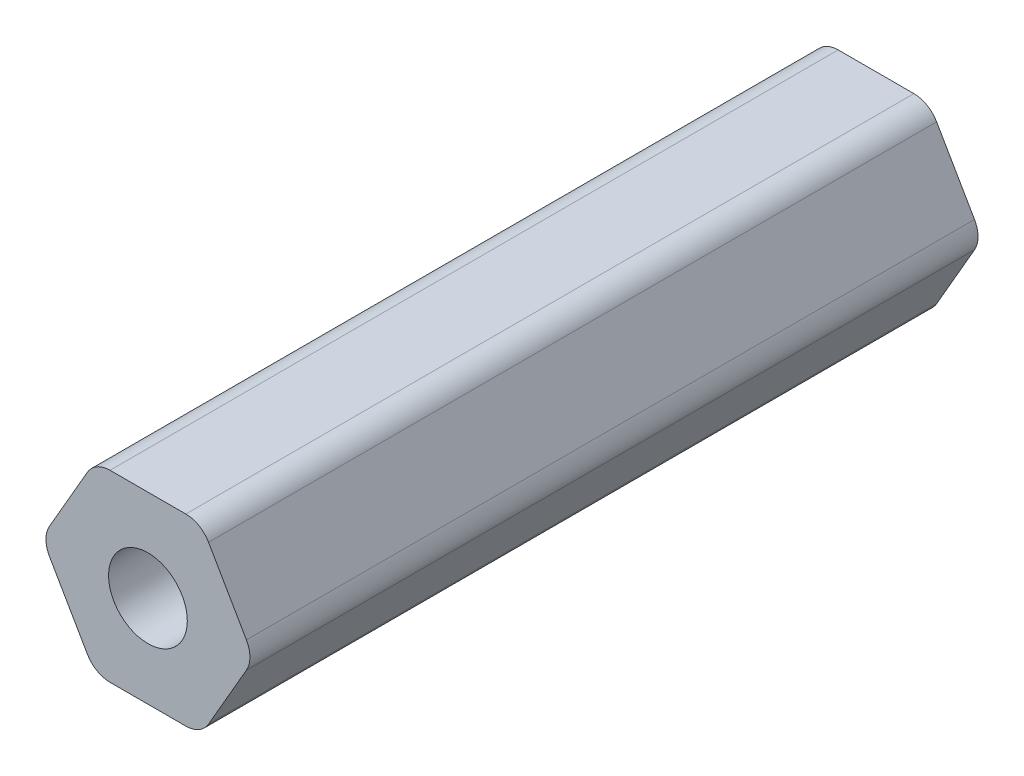
ISO-10303-21;
HEADER;
FILE_DESCRIPTION(('STEP AP214'),'2;1');
FILE_NAME('part.step','',(''),(''),'','','');
FILE_SCHEMA(('AUTOMOTIVE_DESIGN { 1 0 10303 214 1 1 1 1 }'));
ENDSEC;
DATA;
#1=APPLICATION_CONTEXT('core data for automotive mechanical design processes');
#2=APPLICATION_PROTOCOL_DEFINITION('international standard','automotive_design',2000,#1);
#3=PRODUCT_CONTEXT('',#1,'mechanical');
#4=PRODUCT('Part','Part','',(#3));
#5=PRODUCT_RELATED_PRODUCT_CATEGORY('part','',(#4));
#6=PRODUCT_DEFINITION_FORMATION('','',#4);
#7=PRODUCT_DEFINITION_CONTEXT('part definition',#1,'design');
#8=PRODUCT_DEFINITION('design','',#6,#7);
#9=PRODUCT_DEFINITION_SHAPE('','',#8);
#10=(LENGTH_UNIT() NAMED_UNIT(*) SI_UNIT(.MILLI.,.METRE.));
#11=(NAMED_UNIT(*) PLANE_ANGLE_UNIT() SI_UNIT($,.RADIAN.));
#12=(NAMED_UNIT(*) SI_UNIT($,.STERADIAN.) SOLID_ANGLE_UNIT());
#13=UNCERTAINTY_MEASURE_WITH_UNIT(LENGTH_MEASURE(1.E-05),#10,'distance_accuracy_value','');
#14=(GEOMETRIC_REPRESENTATION_CONTEXT(3) GLOBAL_UNCERTAINTY_ASSIGNED_CONTEXT((#13)) GLOBAL_UNIT_ASSIGNED_CONTEXT((#10,
#11,#12)) REPRESENTATION_CONTEXT('',''));
#15=CARTESIAN_POINT('',(0.,0.,0.));
#16=DIRECTION('',(0.,0.,1.));
#17=DIRECTION('',(1.,0.,0.));
#18=AXIS2_PLACEMENT_3D('',#15,#16,#17);
#19=CARTESIAN_POINT('',(-2.88675134594813,0.,27.75));
#20=DIRECTION('',(0.,0.,1.));
#21=DIRECTION('',(1.,0.,0.));
#22=AXIS2_PLACEMENT_3D('',#19,#20,#21);
#23=PLANE('',#22);
#24=CARTESIAN_POINT('',(-2.88675134594813,0.,27.75));
#25=DIRECTION('',(0.,0.,1.));
#26=DIRECTION('',(1.,0.,0.));
#27=AXIS2_PLACEMENT_3D('',#24,#25,#26);
#28=CIRCLE('',#27,1.);
#29=CARTESIAN_POINT('',(-3.75277674973257,0.500000000000003,27.75));
#30=VERTEX_POINT('',#29);
#31=CARTESIAN_POINT('',(-3.75277674973257,-0.500000000000004,27.75));
#32=VERTEX_POINT('',#31);
#33=EDGE_CURVE('E179',#30,#32,#28,.T.);
#34=ORIENTED_EDGE('',*,*,#33,.T.);
#35=DIRECTION('',(0.5,-0.866025403784439,0.));
#36=VECTOR('',#35,1.);
#37=CARTESIAN_POINT('',(-3.75277674973257,-0.500000000000004,27.75));
#38=LINE('',#37,#36);
#39=CARTESIAN_POINT('',(-2.30940107675851,-3.,27.75));
#40=VERTEX_POINT('',#39);
#41=EDGE_CURVE('E107',#32,#40,#38,.T.);
#42=ORIENTED_EDGE('',*,*,#41,.T.);
#43=CARTESIAN_POINT('',(-1.44337567297407,-2.5,27.75));
#44=DIRECTION('',(0.,0.,1.));
#45=DIRECTION('',(1.,0.,0.));
#46=AXIS2_PLACEMENT_3D('',#43,#44,#45);
#47=CIRCLE('',#46,1.);
#48=CARTESIAN_POINT('',(-1.44337567297406,-3.5,27.75));
#49=VERTEX_POINT('',#48);
#50=EDGE_CURVE('E206',#40,#49,#47,.T.);
#51=ORIENTED_EDGE('',*,*,#50,.T.);
#52=DIRECTION('',(1.,0.,0.));
#53=VECTOR('',#52,1.);
#54=CARTESIAN_POINT('',(-1.44337567297406,-3.5,27.75));
#55=LINE('',#54,#53);
#56=CARTESIAN_POINT('',(1.44337567297406,-3.5,27.75));
#57=VERTEX_POINT('',#56);
#58=EDGE_CURVE('E225',#49,#57,#55,.T.);
#59=ORIENTED_EDGE('',*,*,#58,.T.);
#60=CARTESIAN_POINT('',(1.44337567297406,-2.5,27.75));
#61=DIRECTION('',(0.,0.,1.));
#62=DIRECTION('',(1.,0.,0.));
#63=AXIS2_PLACEMENT_3D('',#60,#61,#62);
#64=CIRCLE('',#63,1.);
#65=CARTESIAN_POINT('',(2.30940107675851,-3.,27.75));
#66=VERTEX_POINT('',#65);
#67=EDGE_CURVE('E222',#57,#66,#64,.T.);
#68=ORIENTED_EDGE('',*,*,#67,.T.);
#69=DIRECTION('',(0.5,0.866025403784439,0.));
#70=VECTOR('',#69,1.);
#71=CARTESIAN_POINT('',(2.30940107675851,-3.,27.75));
#72=LINE('',#71,#70);
#73=CARTESIAN_POINT('',(3.75277674973256,-0.500000000000002,27.75));
#74=VERTEX_POINT('',#73);
#75=EDGE_CURVE('E224',#66,#74,#72,.T.);
#76=ORIENTED_EDGE('',*,*,#75,.T.);
#77=CARTESIAN_POINT('',(2.88675134594813,0.,27.75));
#78=DIRECTION('',(0.,0.,1.));
#79=DIRECTION('',(-1.,0.,0.));
#80=AXIS2_PLACEMENT_3D('',#77,#78,#79);
#81=CIRCLE('',#80,1.);
#82=CARTESIAN_POINT('',(3.75277674973256,0.500000000000006,27.75));
#83=VERTEX_POINT('',#82);
#84=EDGE_CURVE('E227',#74,#83,#81,.T.);
#85=ORIENTED_EDGE('',*,*,#84,.T.);
#86=DIRECTION('',(-0.5,0.866025403784439,0.));
#87=VECTOR('',#86,1.);
#88=CARTESIAN_POINT('',(3.75277674973256,0.500000000000006,27.75));
#89=LINE('',#88,#87);
#90=CARTESIAN_POINT('',(2.3094010767585,3.,27.75));
#91=VERTEX_POINT('',#90);
#92=EDGE_CURVE('E233',#83,#91,#89,.T.);
#93=ORIENTED_EDGE('',*,*,#92,.T.);
#94=CARTESIAN_POINT('',(1.44337567297406,2.5,27.75));
#95=DIRECTION('',(0.,0.,1.));
#96=DIRECTION('',(1.,0.,0.));
#97=AXIS2_PLACEMENT_3D('',#94,#95,#96);
#98=CIRCLE('',#97,1.);
#99=CARTESIAN_POINT('',(1.44337567297406,3.5,27.75));
#100=VERTEX_POINT('',#99);
#101=EDGE_CURVE('E138',#91,#100,#98,.T.);
#102=ORIENTED_EDGE('',*,*,#101,.T.);
#103=DIRECTION('',(-1.,0.,0.));
#104=VECTOR('',#103,1.);
#105=CARTESIAN_POINT('',(1.44337567297406,3.5,27.75));
#106=LINE('',#105,#104);
#107=CARTESIAN_POINT('',(-1.44337567297406,3.5,27.75));
#108=VERTEX_POINT('',#107);
#109=EDGE_CURVE('E132',#100,#108,#106,.T.);
#110=ORIENTED_EDGE('',*,*,#109,.T.);
#111=CARTESIAN_POINT('',(-1.44337567297407,2.5,27.75));
#112=DIRECTION('',(0.,0.,1.));
#113=DIRECTION('',(1.,0.,0.));
#114=AXIS2_PLACEMENT_3D('',#111,#112,#113);
#115=CIRCLE('',#114,1.);
#116=CARTESIAN_POINT('',(-2.30940107675851,3.,27.75));
#117=VERTEX_POINT('',#116);
#118=EDGE_CURVE('E136',#108,#117,#115,.T.);
#119=ORIENTED_EDGE('',*,*,#118,.T.);
#120=DIRECTION('',(-0.5,-0.866025403784439,0.));
#121=VECTOR('',#120,1.);
#122=CARTESIAN_POINT('',(-2.30940107675851,3.,27.75));
#123=LINE('',#122,#121);
#124=EDGE_CURVE('E52',#117,#30,#123,.T.);
#125=ORIENTED_EDGE('',*,*,#124,.T.);
#126=EDGE_LOOP('',(#34,#42,#51,#59,#68,#76,#85,#93,#102,#110,#119,#125));
#127=FACE_BOUND('',#126,.T.);
#128=CARTESIAN_POINT('',(0.,0.,27.75));
#129=DIRECTION('',(0.,0.,1.));
#130=DIRECTION('',(1.,0.,0.));
#131=AXIS2_PLACEMENT_3D('',#128,#129,#130);
#132=CIRCLE('',#131,1.5);
#133=CARTESIAN_POINT('',(1.5,0.,27.75));
#134=VERTEX_POINT('',#133);
#135=EDGE_CURVE('E160',#134,#134,#132,.T.);
#136=ORIENTED_EDGE('',*,*,#135,.F.);
#137=EDGE_LOOP('',(#136));
#138=FACE_BOUND('',#137,.T.);
#139=ADVANCED_FACE('F35',(#127,#138),#23,.T.);
#140=CARTESIAN_POINT('',(-2.88675134594813,0.,0.));
#141=DIRECTION('',(0.,0.,1.));
#142=DIRECTION('',(1.,0.,0.));
#143=AXIS2_PLACEMENT_3D('',#140,#141,#142);
#144=PLANE('',#143);
#145=CARTESIAN_POINT('',(-2.88675134594813,0.,0.));
#146=DIRECTION('',(0.,0.,1.));
#147=DIRECTION('',(1.,0.,0.));
#148=AXIS2_PLACEMENT_3D('',#145,#146,#147);
#149=CIRCLE('',#148,1.);
#150=CARTESIAN_POINT('',(-3.75277674973257,0.500000000000003,0.));
#151=VERTEX_POINT('',#150);
#152=CARTESIAN_POINT('',(-3.75277674973257,-0.500000000000004,0.));
#153=VERTEX_POINT('',#152);
#154=EDGE_CURVE('E156',#151,#153,#149,.T.);
#155=ORIENTED_EDGE('',*,*,#154,.F.);
#156=DIRECTION('',(-0.5,-0.866025403784439,0.));
#157=VECTOR('',#156,1.);
#158=CARTESIAN_POINT('',(-2.30940107675851,3.,0.));
#159=LINE('',#158,#157);
#160=CARTESIAN_POINT('',(-2.30940107675851,3.,0.));
#161=VERTEX_POINT('',#160);
#162=EDGE_CURVE('E99',#161,#151,#159,.T.);
#163=ORIENTED_EDGE('',*,*,#162,.F.);
#164=CARTESIAN_POINT('',(-1.44337567297407,2.5,0.));
#165=DIRECTION('',(0.,0.,1.));
#166=DIRECTION('',(1.,0.,0.));
#167=AXIS2_PLACEMENT_3D('',#164,#165,#166);
#168=CIRCLE('',#167,1.);
#169=CARTESIAN_POINT('',(-1.44337567297406,3.5,0.));
#170=VERTEX_POINT('',#169);
#171=EDGE_CURVE('E93',#170,#161,#168,.T.);
#172=ORIENTED_EDGE('',*,*,#171,.F.);
#173=DIRECTION('',(-1.,0.,0.));
#174=VECTOR('',#173,1.);
#175=CARTESIAN_POINT('',(1.44337567297406,3.5,0.));
#176=LINE('',#175,#174);
#177=CARTESIAN_POINT('',(1.44337567297406,3.5,0.));
#178=VERTEX_POINT('',#177);
#179=EDGE_CURVE('E146',#178,#170,#176,.T.);
#180=ORIENTED_EDGE('',*,*,#179,.F.);
#181=CARTESIAN_POINT('',(1.44337567297406,2.5,0.));
#182=DIRECTION('',(0.,0.,1.));
#183=DIRECTION('',(1.,0.,0.));
#184=AXIS2_PLACEMENT_3D('',#181,#182,#183);
#185=CIRCLE('',#184,1.);
#186=CARTESIAN_POINT('',(2.3094010767585,3.,0.));
#187=VERTEX_POINT('',#186);
#188=EDGE_CURVE('E174',#187,#178,#185,.T.);
#189=ORIENTED_EDGE('',*,*,#188,.F.);
#190=DIRECTION('',(-0.5,0.866025403784439,0.));
#191=VECTOR('',#190,1.);
#192=CARTESIAN_POINT('',(3.75277674973256,0.500000000000006,0.));
#193=LINE('',#192,#191);
#194=CARTESIAN_POINT('',(3.75277674973256,0.500000000000006,0.));
#195=VERTEX_POINT('',#194);
#196=EDGE_CURVE('E172',#195,#187,#193,.T.);
#197=ORIENTED_EDGE('',*,*,#196,.F.);
#198=CARTESIAN_POINT('',(2.88675134594813,0.,0.));
#199=DIRECTION('',(0.,0.,1.));
#200=DIRECTION('',(-1.,0.,0.));
#201=AXIS2_PLACEMENT_3D('',#198,#199,#200);
#202=CIRCLE('',#201,1.);
#203=CARTESIAN_POINT('',(3.75277674973256,-0.500000000000002,0.));
#204=VERTEX_POINT('',#203);
#205=EDGE_CURVE('E170',#204,#195,#202,.T.);
#206=ORIENTED_EDGE('',*,*,#205,.F.);
#207=DIRECTION('',(0.5,0.866025403784439,0.));
#208=VECTOR('',#207,1.);
#209=CARTESIAN_POINT('',(2.30940107675851,-3.,0.));
#210=LINE('',#209,#208);
#211=CARTESIAN_POINT('',(2.30940107675851,-3.,0.));
#212=VERTEX_POINT('',#211);
#213=EDGE_CURVE('E168',#212,#204,#210,.T.);
#214=ORIENTED_EDGE('',*,*,#213,.F.);
#215=CARTESIAN_POINT('',(1.44337567297406,-2.5,0.));
#216=DIRECTION('',(0.,0.,1.));
#217=DIRECTION('',(1.,0.,0.));
#218=AXIS2_PLACEMENT_3D('',#215,#216,#217);
#219=CIRCLE('',#218,1.);
#220=CARTESIAN_POINT('',(1.44337567297406,-3.5,0.));
#221=VERTEX_POINT('',#220);
#222=EDGE_CURVE('E166',#221,#212,#219,.T.);
#223=ORIENTED_EDGE('',*,*,#222,.F.);
#224=DIRECTION('',(1.,0.,0.));
#225=VECTOR('',#224,1.);
#226=CARTESIAN_POINT('',(-1.44337567297406,-3.5,0.));
#227=LINE('',#226,#225);
#228=CARTESIAN_POINT('',(-1.44337567297406,-3.5,0.));
#229=VERTEX_POINT('',#228);
#230=EDGE_CURVE('E164',#229,#221,#227,.T.);
#231=ORIENTED_EDGE('',*,*,#230,.F.);
#232=CARTESIAN_POINT('',(-1.44337567297407,-2.5,0.));
#233=DIRECTION('',(0.,0.,1.));
#234=DIRECTION('',(1.,0.,0.));
#235=AXIS2_PLACEMENT_3D('',#232,#233,#234);
#236=CIRCLE('',#235,1.);
#237=CARTESIAN_POINT('',(-2.30940107675851,-3.,0.));
#238=VERTEX_POINT('',#237);
#239=EDGE_CURVE('E162',#238,#229,#236,.T.);
#240=ORIENTED_EDGE('',*,*,#239,.F.);
#241=DIRECTION('',(0.5,-0.866025403784439,0.));
#242=VECTOR('',#241,1.);
#243=CARTESIAN_POINT('',(-3.75277674973257,-0.500000000000004,0.));
#244=LINE('',#243,#242);
#245=EDGE_CURVE('E159',#153,#238,#244,.T.);
#246=ORIENTED_EDGE('',*,*,#245,.F.);
#247=EDGE_LOOP('',(#155,#163,#172,#180,#189,#197,#206,#214,#223,#231,#240,#246));
#248=FACE_BOUND('',#247,.T.);
#249=CARTESIAN_POINT('',(0.,0.,0.));
#250=DIRECTION('',(0.,0.,1.));
#251=DIRECTION('',(1.,0.,0.));
#252=AXIS2_PLACEMENT_3D('',#249,#250,#251);
#253=CIRCLE('',#252,1.5);
#254=CARTESIAN_POINT('',(1.5,0.,0.));
#255=VERTEX_POINT('',#254);
#256=EDGE_CURVE('E380',#255,#255,#253,.T.);
#257=ORIENTED_EDGE('',*,*,#256,.T.);
#258=EDGE_LOOP('',(#257));
#259=FACE_BOUND('',#258,.T.);
#260=ADVANCED_FACE('F210',(#248,#259),#144,.F.);
#261=CARTESIAN_POINT('',(-2.88675134594813,0.,27.75));
#262=DIRECTION('',(0.,0.,-1.));
#263=DIRECTION('',(-1.,0.,0.));
#264=AXIS2_PLACEMENT_3D('',#261,#262,#263);
#265=CYLINDRICAL_SURFACE('',#264,1.);
#266=ORIENTED_EDGE('',*,*,#154,.T.);
#267=DIRECTION('',(0.,0.,-1.));
#268=VECTOR('',#267,1.);
#269=CARTESIAN_POINT('',(-3.75277674973257,-0.500000000000004,27.75));
#270=LINE('',#269,#268);
#271=EDGE_CURVE('E11',#32,#153,#270,.T.);
#272=ORIENTED_EDGE('',*,*,#271,.F.);
#273=ORIENTED_EDGE('',*,*,#33,.F.);
#274=DIRECTION('',(0.,0.,-1.));
#275=VECTOR('',#274,1.);
#276=CARTESIAN_POINT('',(-3.75277674973257,0.500000000000003,27.75));
#277=LINE('',#276,#275);
#278=EDGE_CURVE('E152',#30,#151,#277,.T.);
#279=ORIENTED_EDGE('',*,*,#278,.T.);
#280=EDGE_LOOP('',(#266,#272,#273,#279));
#281=FACE_BOUND('',#280,.T.);
#282=ADVANCED_FACE('F37',(#281),#265,.T.);
#283=CARTESIAN_POINT('',(-3.75277674973257,-0.500000000000004,27.75));
#284=DIRECTION('',(0.866025403784439,0.5,0.));
#285=DIRECTION('',(-0.5,0.866025403784439,0.));
#286=AXIS2_PLACEMENT_3D('',#283,#284,#285);
#287=PLANE('',#286);
#288=ORIENTED_EDGE('',*,*,#245,.T.);
#289=DIRECTION('',(0.,0.,-1.));
#290=VECTOR('',#289,1.);
#291=CARTESIAN_POINT('',(-2.30940107675851,-3.,27.75));
#292=LINE('',#291,#290);
#293=EDGE_CURVE('E44',#40,#238,#292,.T.);
#294=ORIENTED_EDGE('',*,*,#293,.F.);
#295=ORIENTED_EDGE('',*,*,#41,.F.);
#296=ORIENTED_EDGE('',*,*,#271,.T.);
#297=EDGE_LOOP('',(#288,#294,#295,#296));
#298=FACE_BOUND('',#297,.T.);
#299=ADVANCED_FACE('F267',(#298),#287,.F.);
#300=CARTESIAN_POINT('',(-1.44337567297407,-2.5,27.75));
#301=DIRECTION('',(0.,0.,-1.));
#302=DIRECTION('',(-1.,0.,0.));
#303=AXIS2_PLACEMENT_3D('',#300,#301,#302);
#304=CYLINDRICAL_SURFACE('',#303,1.);
#305=ORIENTED_EDGE('',*,*,#239,.T.);
#306=DIRECTION('',(0.,0.,-1.));
#307=VECTOR('',#306,1.);
#308=CARTESIAN_POINT('',(-1.44337567297406,-3.5,27.75));
#309=LINE('',#308,#307);
#310=EDGE_CURVE('E198',#49,#229,#309,.T.);
#311=ORIENTED_EDGE('',*,*,#310,.F.);
#312=ORIENTED_EDGE('',*,*,#50,.F.);
#313=ORIENTED_EDGE('',*,*,#293,.T.);
#314=EDGE_LOOP('',(#305,#311,#312,#313));
#315=FACE_BOUND('',#314,.T.);
#316=ADVANCED_FACE('F204',(#315),#304,.T.);
#317=CARTESIAN_POINT('',(-1.44337567297406,-3.5,27.75));
#318=DIRECTION('',(0.,1.,0.));
#319=DIRECTION('',(-1.,0.,0.));
#320=AXIS2_PLACEMENT_3D('',#317,#318,#319);
#321=PLANE('',#320);
#322=ORIENTED_EDGE('',*,*,#230,.T.);
#323=DIRECTION('',(0.,0.,-1.));
#324=VECTOR('',#323,1.);
#325=CARTESIAN_POINT('',(1.44337567297406,-3.5,27.75));
#326=LINE('',#325,#324);
#327=EDGE_CURVE('E195',#57,#221,#326,.T.);
#328=ORIENTED_EDGE('',*,*,#327,.F.);
#329=ORIENTED_EDGE('',*,*,#58,.F.);
#330=ORIENTED_EDGE('',*,*,#310,.T.);
#331=EDGE_LOOP('',(#322,#328,#329,#330));
#332=FACE_BOUND('',#331,.T.);
#333=ADVANCED_FACE('F216',(#332),#321,.F.);
#334=CARTESIAN_POINT('',(1.44337567297406,-2.5,27.75));
#335=DIRECTION('',(0.,0.,-1.));
#336=DIRECTION('',(-1.,0.,0.));
#337=AXIS2_PLACEMENT_3D('',#334,#335,#336);
#338=CYLINDRICAL_SURFACE('',#337,1.);
#339=ORIENTED_EDGE('',*,*,#222,.T.);
#340=DIRECTION('',(0.,0.,-1.));
#341=VECTOR('',#340,1.);
#342=CARTESIAN_POINT('',(2.30940107675851,-3.,27.75));
#343=LINE('',#342,#341);
#344=EDGE_CURVE('E192',#66,#212,#343,.T.);
#345=ORIENTED_EDGE('',*,*,#344,.F.);
#346=ORIENTED_EDGE('',*,*,#67,.F.);
#347=ORIENTED_EDGE('',*,*,#327,.T.);
#348=EDGE_LOOP('',(#339,#345,#346,#347));
#349=FACE_BOUND('',#348,.T.);
#350=ADVANCED_FACE('F220',(#349),#338,.T.);
#351=CARTESIAN_POINT('',(2.30940107675851,-3.,27.75));
#352=DIRECTION('',(-0.866025403784439,0.5,0.));
#353=DIRECTION('',(-0.5,-0.866025403784439,0.));
#354=AXIS2_PLACEMENT_3D('',#351,#352,#353);
#355=PLANE('',#354);
#356=ORIENTED_EDGE('',*,*,#213,.T.);
#357=DIRECTION('',(0.,0.,-1.));
#358=VECTOR('',#357,1.);
#359=CARTESIAN_POINT('',(3.75277674973256,-0.500000000000002,27.75));
#360=LINE('',#359,#358);
#361=EDGE_CURVE('E189',#74,#204,#360,.T.);
#362=ORIENTED_EDGE('',*,*,#361,.F.);
#363=ORIENTED_EDGE('',*,*,#75,.F.);
#364=ORIENTED_EDGE('',*,*,#344,.T.);
#365=EDGE_LOOP('',(#356,#362,#363,#364));
#366=FACE_BOUND('',#365,.T.);
#367=ADVANCED_FACE('F280',(#366),#355,.F.);
#368=CARTESIAN_POINT('',(2.88675134594813,0.,27.75));
#369=DIRECTION('',(0.,0.,-1.));
#370=DIRECTION('',(-1.,0.,0.));
#371=AXIS2_PLACEMENT_3D('',#368,#369,#370);
#372=CYLINDRICAL_SURFACE('',#371,1.);
#373=ORIENTED_EDGE('',*,*,#205,.T.);
#374=DIRECTION('',(0.,0.,-1.));
#375=VECTOR('',#374,1.);
#376=CARTESIAN_POINT('',(3.75277674973256,0.500000000000006,27.75));
#377=LINE('',#376,#375);
#378=EDGE_CURVE('E186',#83,#195,#377,.T.);
#379=ORIENTED_EDGE('',*,*,#378,.F.);
#380=ORIENTED_EDGE('',*,*,#84,.F.);
#381=ORIENTED_EDGE('',*,*,#361,.T.);
#382=EDGE_LOOP('',(#373,#379,#380,#381));
#383=FACE_BOUND('',#382,.T.);
#384=ADVANCED_FACE('F283',(#383),#372,.T.);
#385=CARTESIAN_POINT('',(3.75277674973256,0.500000000000006,27.75));
#386=DIRECTION('',(-0.866025403784439,-0.5,0.));
#387=DIRECTION('',(0.5,-0.866025403784439,0.));
#388=AXIS2_PLACEMENT_3D('',#385,#386,#387);
#389=PLANE('',#388);
#390=ORIENTED_EDGE('',*,*,#196,.T.);
#391=DIRECTION('',(0.,0.,-1.));
#392=VECTOR('',#391,1.);
#393=CARTESIAN_POINT('',(2.3094010767585,3.,27.75));
#394=LINE('',#393,#392);
#395=EDGE_CURVE('E183',#91,#187,#394,.T.);
#396=ORIENTED_EDGE('',*,*,#395,.F.);
#397=ORIENTED_EDGE('',*,*,#92,.F.);
#398=ORIENTED_EDGE('',*,*,#378,.T.);
#399=EDGE_LOOP('',(#390,#396,#397,#398));
#400=FACE_BOUND('',#399,.T.);
#401=ADVANCED_FACE('F239',(#400),#389,.F.);
#402=CARTESIAN_POINT('',(1.44337567297406,2.5,27.75));
#403=DIRECTION('',(0.,0.,-1.));
#404=DIRECTION('',(-1.,0.,0.));
#405=AXIS2_PLACEMENT_3D('',#402,#403,#404);
#406=CYLINDRICAL_SURFACE('',#405,1.);
#407=ORIENTED_EDGE('',*,*,#188,.T.);
#408=DIRECTION('',(0.,0.,-1.));
#409=VECTOR('',#408,1.);
#410=CARTESIAN_POINT('',(1.44337567297406,3.5,27.75));
#411=LINE('',#410,#409);
#412=EDGE_CURVE('E147',#100,#178,#411,.T.);
#413=ORIENTED_EDGE('',*,*,#412,.F.);
#414=ORIENTED_EDGE('',*,*,#101,.F.);
#415=ORIENTED_EDGE('',*,*,#395,.T.);
#416=EDGE_LOOP('',(#407,#413,#414,#415));
#417=FACE_BOUND('',#416,.T.);
#418=ADVANCED_FACE('F243',(#417),#406,.T.);
#419=CARTESIAN_POINT('',(1.44337567297406,3.5,27.75));
#420=DIRECTION('',(0.,-1.,0.));
#421=DIRECTION('',(0.,0.,-1.));
#422=AXIS2_PLACEMENT_3D('',#419,#420,#421);
#423=PLANE('',#422);
#424=ORIENTED_EDGE('',*,*,#179,.T.);
#425=DIRECTION('',(0.,0.,-1.));
#426=VECTOR('',#425,1.);
#427=CARTESIAN_POINT('',(-1.44337567297406,3.5,27.75));
#428=LINE('',#427,#426);
#429=EDGE_CURVE('E143',#108,#170,#428,.T.);
#430=ORIENTED_EDGE('',*,*,#429,.F.);
#431=ORIENTED_EDGE('',*,*,#109,.F.);
#432=ORIENTED_EDGE('',*,*,#412,.T.);
#433=EDGE_LOOP('',(#424,#430,#431,#432));
#434=FACE_BOUND('',#433,.T.);
#435=ADVANCED_FACE('F144',(#434),#423,.F.);
#436=CARTESIAN_POINT('',(-1.44337567297407,2.5,27.75));
#437=DIRECTION('',(0.,0.,-1.));
#438=DIRECTION('',(-1.,0.,0.));
#439=AXIS2_PLACEMENT_3D('',#436,#437,#438);
#440=CYLINDRICAL_SURFACE('',#439,1.);
#441=ORIENTED_EDGE('',*,*,#171,.T.);
#442=DIRECTION('',(0.,0.,-1.));
#443=VECTOR('',#442,1.);
#444=CARTESIAN_POINT('',(-2.30940107675851,3.,27.75));
#445=LINE('',#444,#443);
#446=EDGE_CURVE('E148',#117,#161,#445,.T.);
#447=ORIENTED_EDGE('',*,*,#446,.F.);
#448=ORIENTED_EDGE('',*,*,#118,.F.);
#449=ORIENTED_EDGE('',*,*,#429,.T.);
#450=EDGE_LOOP('',(#441,#447,#448,#449));
#451=FACE_BOUND('',#450,.T.);
#452=ADVANCED_FACE('F150',(#451),#440,.T.);
#453=CARTESIAN_POINT('',(-2.30940107675851,3.,27.75));
#454=DIRECTION('',(0.866025403784439,-0.5,0.));
#455=DIRECTION('',(0.5,0.866025403784439,0.));
#456=AXIS2_PLACEMENT_3D('',#453,#454,#455);
#457=PLANE('',#456);
#458=ORIENTED_EDGE('',*,*,#162,.T.);
#459=ORIENTED_EDGE('',*,*,#278,.F.);
#460=ORIENTED_EDGE('',*,*,#124,.F.);
#461=ORIENTED_EDGE('',*,*,#446,.T.);
#462=EDGE_LOOP('',(#458,#459,#460,#461));
#463=FACE_BOUND('',#462,.T.);
#464=ADVANCED_FACE('F247',(#463),#457,.F.);
#465=CARTESIAN_POINT('',(0.,0.,27.75));
#466=DIRECTION('',(0.,0.,-1.));
#467=DIRECTION('',(-1.,0.,0.));
#468=AXIS2_PLACEMENT_3D('',#465,#466,#467);
#469=CYLINDRICAL_SURFACE('',#468,1.5);
#470=ORIENTED_EDGE('',*,*,#135,.T.);
#471=EDGE_LOOP('',(#470));
#472=FACE_BOUND('',#471,.T.);
#473=ORIENTED_EDGE('',*,*,#256,.F.);
#474=EDGE_LOOP('',(#473));
#475=FACE_BOUND('',#474,.T.);
#476=ADVANCED_FACE('F249',(#472,#475),#469,.F.);
#477=CLOSED_SHELL('',(#139,#260,#282,#299,#316,#333,#350,#367,#384,#401,#418,#435,#452,#464,#476));
#478=MANIFOLD_SOLID_BREP('B2',#477);
#479=ADVANCED_BREP_SHAPE_REPRESENTATION('',(#18,#478),#14);
#480=SHAPE_DEFINITION_REPRESENTATION(#9,#479);
ENDSEC;
END-ISO-10303-21;
